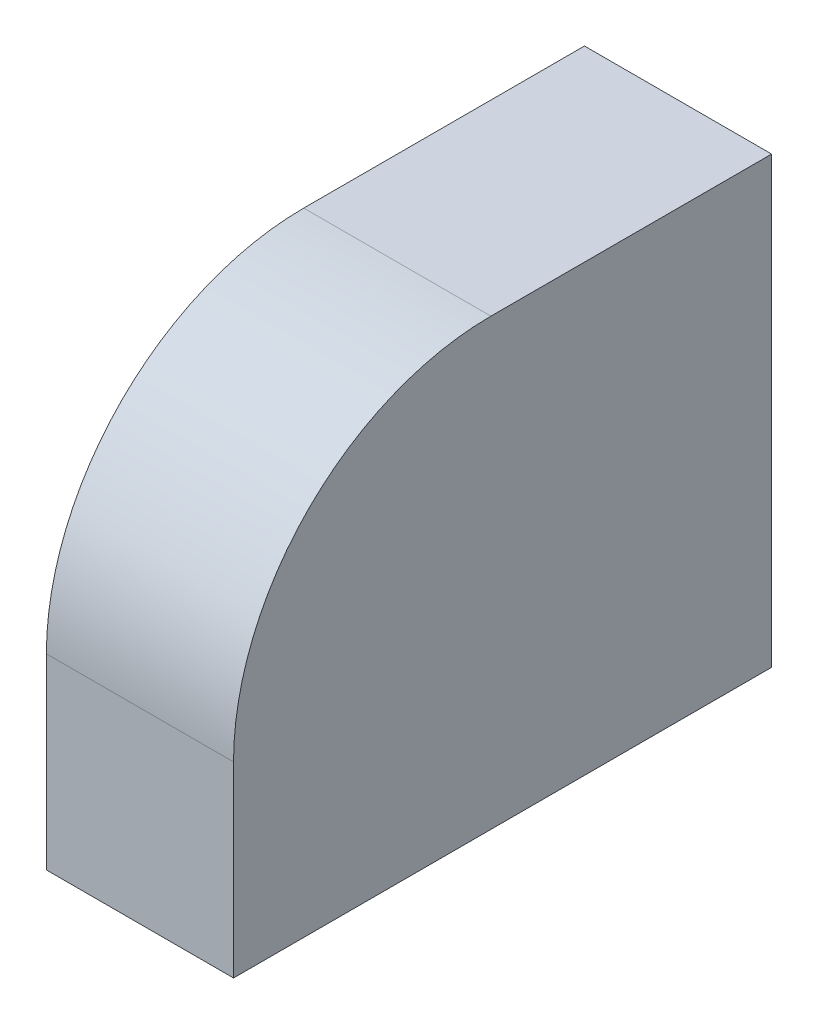
ISO-10303-21;
HEADER;
FILE_DESCRIPTION(('STEP AP214'),'2;1');
FILE_NAME('part.step','',(''),(''),'','','');
FILE_SCHEMA(('AUTOMOTIVE_DESIGN { 1 0 10303 214 1 1 1 1 }'));
ENDSEC;
DATA;
#1=APPLICATION_CONTEXT('core data for automotive mechanical design processes');
#2=APPLICATION_PROTOCOL_DEFINITION('international standard','automotive_design',2000,#1);
#3=PRODUCT_CONTEXT('',#1,'mechanical');
#4=PRODUCT('Part','Part','',(#3));
#5=PRODUCT_RELATED_PRODUCT_CATEGORY('part','',(#4));
#6=PRODUCT_DEFINITION_FORMATION('','',#4);
#7=PRODUCT_DEFINITION_CONTEXT('part definition',#1,'design');
#8=PRODUCT_DEFINITION('design','',#6,#7);
#9=PRODUCT_DEFINITION_SHAPE('','',#8);
#10=(LENGTH_UNIT() NAMED_UNIT(*) SI_UNIT(.MILLI.,.METRE.));
#11=(NAMED_UNIT(*) PLANE_ANGLE_UNIT() SI_UNIT($,.RADIAN.));
#12=(NAMED_UNIT(*) SI_UNIT($,.STERADIAN.) SOLID_ANGLE_UNIT());
#13=UNCERTAINTY_MEASURE_WITH_UNIT(LENGTH_MEASURE(1.E-05),#10,'distance_accuracy_value','');
#14=(GEOMETRIC_REPRESENTATION_CONTEXT(3) GLOBAL_UNCERTAINTY_ASSIGNED_CONTEXT((#13)) GLOBAL_UNIT_ASSIGNED_CONTEXT((#10,
#11,#12)) REPRESENTATION_CONTEXT('',''));
#15=CARTESIAN_POINT('',(0.,0.,0.));
#16=DIRECTION('',(0.,0.,1.));
#17=DIRECTION('',(1.,0.,0.));
#18=AXIS2_PLACEMENT_3D('',#15,#16,#17);
#19=CARTESIAN_POINT('',(-10.0000001192093,22.375,-3.12500004470348));
#20=DIRECTION('',(1.,0.,0.));
#21=DIRECTION('',(0.,0.,-1.));
#22=AXIS2_PLACEMENT_3D('',#19,#20,#21);
#23=PLANE('',#22);
#24=CARTESIAN_POINT('',(-10.0000001192093,22.,-3.));
#25=DIRECTION('',(1.,0.,0.));
#26=DIRECTION('',(0.,0.,-1.));
#27=AXIS2_PLACEMENT_3D('',#24,#25,#26);
#28=CIRCLE('',#27,2.75);
#29=CARTESIAN_POINT('',(-10.0000001192093,24.75,-3.));
#30=VERTEX_POINT('',#29);
#31=CARTESIAN_POINT('',(-10.0000001192093,22.,-0.250000000000001));
#32=VERTEX_POINT('',#31);
#33=EDGE_CURVE('E18',#30,#32,#28,.T.);
#34=ORIENTED_EDGE('',*,*,#33,.F.);
#35=DIRECTION('',(0.,0.,1.));
#36=VECTOR('',#35,1.);
#37=CARTESIAN_POINT('',(-10.0000001192093,24.75,-6.00000008940697));
#38=LINE('',#37,#36);
#39=CARTESIAN_POINT('',(-10.0000001192093,24.75,-6.00000008940697));
#40=VERTEX_POINT('',#39);
#41=EDGE_CURVE('E54',#40,#30,#38,.T.);
#42=ORIENTED_EDGE('',*,*,#41,.F.);
#43=DIRECTION('',(0.,1.,0.));
#44=VECTOR('',#43,1.);
#45=CARTESIAN_POINT('',(-10.0000001192093,20.,-6.00000008940697));
#46=LINE('',#45,#44);
#47=CARTESIAN_POINT('',(-10.0000001192093,20.,-6.00000008940697));
#48=VERTEX_POINT('',#47);
#49=EDGE_CURVE('E77',#48,#40,#46,.T.);
#50=ORIENTED_EDGE('',*,*,#49,.F.);
#51=DIRECTION('',(0.,0.,-1.));
#52=VECTOR('',#51,1.);
#53=CARTESIAN_POINT('',(-10.0000001192093,20.,-0.25));
#54=LINE('',#53,#52);
#55=CARTESIAN_POINT('',(-10.0000001192093,20.,-0.25));
#56=VERTEX_POINT('',#55);
#57=EDGE_CURVE('E75',#56,#48,#54,.T.);
#58=ORIENTED_EDGE('',*,*,#57,.F.);
#59=DIRECTION('',(0.,-1.,0.));
#60=VECTOR('',#59,1.);
#61=CARTESIAN_POINT('',(-10.0000001192093,22.,-0.250000000000001));
#62=LINE('',#61,#60);
#63=EDGE_CURVE('E102',#32,#56,#62,.T.);
#64=ORIENTED_EDGE('',*,*,#63,.F.);
#65=EDGE_LOOP('',(#34,#42,#50,#58,#64));
#66=FACE_BOUND('',#65,.T.);
#67=ADVANCED_FACE('F15',(#66),#23,.F.);
#68=CARTESIAN_POINT('',(-10.0000001192093,22.,-0.250000000000001));
#69=DIRECTION('',(0.,0.,1.));
#70=DIRECTION('',(0.,-1.,0.));
#71=AXIS2_PLACEMENT_3D('',#68,#69,#70);
#72=PLANE('',#71);
#73=DIRECTION('',(0.,1.,0.));
#74=VECTOR('',#73,1.);
#75=CARTESIAN_POINT('',(-8.00000011920929,22.375,-0.250000000000001));
#76=LINE('',#75,#74);
#77=CARTESIAN_POINT('',(-8.00000011920929,22.,-0.250000000000001));
#78=VERTEX_POINT('',#77);
#79=CARTESIAN_POINT('',(-8.00000011920929,20.,-0.250000000000001));
#80=VERTEX_POINT('',#79);
#81=EDGE_CURVE('E88',#78,#80,#76,.F.);
#82=ORIENTED_EDGE('',*,*,#81,.F.);
#83=DIRECTION('',(1.,0.,0.));
#84=VECTOR('',#83,1.);
#85=CARTESIAN_POINT('',(-10.0000001192093,22.,-0.25));
#86=LINE('',#85,#84);
#87=EDGE_CURVE('E113',#32,#78,#86,.T.);
#88=ORIENTED_EDGE('',*,*,#87,.F.);
#89=ORIENTED_EDGE('',*,*,#63,.T.);
#90=DIRECTION('',(1.,0.,0.));
#91=VECTOR('',#90,1.);
#92=CARTESIAN_POINT('',(-10.0000001192093,20.,-0.25));
#93=LINE('',#92,#91);
#94=EDGE_CURVE('E62',#80,#56,#93,.F.);
#95=ORIENTED_EDGE('',*,*,#94,.F.);
#96=EDGE_LOOP('',(#82,#88,#89,#95));
#97=FACE_BOUND('',#96,.T.);
#98=ADVANCED_FACE('F129',(#97),#72,.T.);
#99=CARTESIAN_POINT('',(-10.0000001192093,20.,-0.25));
#100=DIRECTION('',(0.,-1.,0.));
#101=DIRECTION('',(0.,0.,-1.));
#102=AXIS2_PLACEMENT_3D('',#99,#100,#101);
#103=PLANE('',#102);
#104=DIRECTION('',(0.,0.,-1.));
#105=VECTOR('',#104,1.);
#106=CARTESIAN_POINT('',(-8.00000011920929,20.,-3.12500004470348));
#107=LINE('',#106,#105);
#108=CARTESIAN_POINT('',(-8.00000011920929,20.,-6.00000008940697));
#109=VERTEX_POINT('',#108);
#110=EDGE_CURVE('E72',#80,#109,#107,.T.);
#111=ORIENTED_EDGE('',*,*,#110,.F.);
#112=ORIENTED_EDGE('',*,*,#94,.T.);
#113=ORIENTED_EDGE('',*,*,#57,.T.);
#114=DIRECTION('',(-1.,0.,0.));
#115=VECTOR('',#114,1.);
#116=CARTESIAN_POINT('',(-10.0000001192093,20.,-6.00000008940697));
#117=LINE('',#116,#115);
#118=EDGE_CURVE('E68',#109,#48,#117,.T.);
#119=ORIENTED_EDGE('',*,*,#118,.F.);
#120=EDGE_LOOP('',(#111,#112,#113,#119));
#121=FACE_BOUND('',#120,.T.);
#122=ADVANCED_FACE('F70',(#121),#103,.T.);
#123=CARTESIAN_POINT('',(-10.0000001192093,20.,-6.00000008940697));
#124=DIRECTION('',(0.,0.,-1.));
#125=DIRECTION('',(-1.,0.,0.));
#126=AXIS2_PLACEMENT_3D('',#123,#124,#125);
#127=PLANE('',#126);
#128=DIRECTION('',(0.,1.,0.));
#129=VECTOR('',#128,1.);
#130=CARTESIAN_POINT('',(-8.00000011920929,22.375,-6.00000008940697));
#131=LINE('',#130,#129);
#132=CARTESIAN_POINT('',(-8.00000011920929,24.75,-6.00000008940697));
#133=VERTEX_POINT('',#132);
#134=EDGE_CURVE('E80',#109,#133,#131,.T.);
#135=ORIENTED_EDGE('',*,*,#134,.F.);
#136=ORIENTED_EDGE('',*,*,#118,.T.);
#137=ORIENTED_EDGE('',*,*,#49,.T.);
#138=DIRECTION('',(1.,0.,0.));
#139=VECTOR('',#138,1.);
#140=CARTESIAN_POINT('',(-10.0000001192093,24.75,-6.00000008940697));
#141=LINE('',#140,#139);
#142=EDGE_CURVE('E83',#133,#40,#141,.F.);
#143=ORIENTED_EDGE('',*,*,#142,.F.);
#144=EDGE_LOOP('',(#135,#136,#137,#143));
#145=FACE_BOUND('',#144,.T.);
#146=ADVANCED_FACE('F81',(#145),#127,.T.);
#147=CARTESIAN_POINT('',(-10.0000001192093,24.75,-6.00000008940697));
#148=DIRECTION('',(0.,1.,0.));
#149=DIRECTION('',(0.,0.,1.));
#150=AXIS2_PLACEMENT_3D('',#147,#148,#149);
#151=PLANE('',#150);
#152=DIRECTION('',(0.,0.,-1.));
#153=VECTOR('',#152,1.);
#154=CARTESIAN_POINT('',(-8.00000011920929,24.75,-3.12500004470348));
#155=LINE('',#154,#153);
#156=CARTESIAN_POINT('',(-8.00000011920929,24.75,-3.));
#157=VERTEX_POINT('',#156);
#158=EDGE_CURVE('E24',#133,#157,#155,.F.);
#159=ORIENTED_EDGE('',*,*,#158,.F.);
#160=ORIENTED_EDGE('',*,*,#142,.T.);
#161=ORIENTED_EDGE('',*,*,#41,.T.);
#162=DIRECTION('',(1.,0.,0.));
#163=VECTOR('',#162,1.);
#164=CARTESIAN_POINT('',(-10.0000001192093,24.75,-3.));
#165=LINE('',#164,#163);
#166=EDGE_CURVE('E32',#157,#30,#165,.F.);
#167=ORIENTED_EDGE('',*,*,#166,.F.);
#168=EDGE_LOOP('',(#159,#160,#161,#167));
#169=FACE_BOUND('',#168,.T.);
#170=ADVANCED_FACE('F111',(#169),#151,.T.);
#171=CARTESIAN_POINT('',(-10.0000001192093,22.,-3.));
#172=DIRECTION('',(1.,0.,0.));
#173=DIRECTION('',(0.,0.,-1.));
#174=AXIS2_PLACEMENT_3D('',#171,#172,#173);
#175=CYLINDRICAL_SURFACE('',#174,2.75);
#176=CARTESIAN_POINT('',(-8.00000011920929,22.,-3.));
#177=DIRECTION('',(1.,0.,0.));
#178=DIRECTION('',(0.,0.,-1.));
#179=AXIS2_PLACEMENT_3D('',#176,#177,#178);
#180=CIRCLE('',#179,2.75);
#181=EDGE_CURVE('E10',#157,#78,#180,.T.);
#182=ORIENTED_EDGE('',*,*,#181,.F.);
#183=ORIENTED_EDGE('',*,*,#166,.T.);
#184=ORIENTED_EDGE('',*,*,#33,.T.);
#185=ORIENTED_EDGE('',*,*,#87,.T.);
#186=EDGE_LOOP('',(#182,#183,#184,#185));
#187=FACE_BOUND('',#186,.T.);
#188=ADVANCED_FACE('F127',(#187),#175,.T.);
#189=CARTESIAN_POINT('',(-8.00000011920929,22.375,-3.12500004470348));
#190=DIRECTION('',(1.,0.,0.));
#191=DIRECTION('',(0.,0.,-1.));
#192=AXIS2_PLACEMENT_3D('',#189,#190,#191);
#193=PLANE('',#192);
#194=ORIENTED_EDGE('',*,*,#158,.T.);
#195=ORIENTED_EDGE('',*,*,#181,.T.);
#196=ORIENTED_EDGE('',*,*,#81,.T.);
#197=ORIENTED_EDGE('',*,*,#110,.T.);
#198=ORIENTED_EDGE('',*,*,#134,.T.);
#199=EDGE_LOOP('',(#194,#195,#196,#197,#198));
#200=FACE_BOUND('',#199,.T.);
#201=ADVANCED_FACE('F87',(#200),#193,.T.);
#202=CLOSED_SHELL('',(#67,#98,#122,#146,#170,#188,#201));
#203=MANIFOLD_SOLID_BREP('B1',#202);
#204=ADVANCED_BREP_SHAPE_REPRESENTATION('',(#18,#203),#14);
#205=SHAPE_DEFINITION_REPRESENTATION(#9,#204);
ENDSEC;
END-ISO-10303-21;
